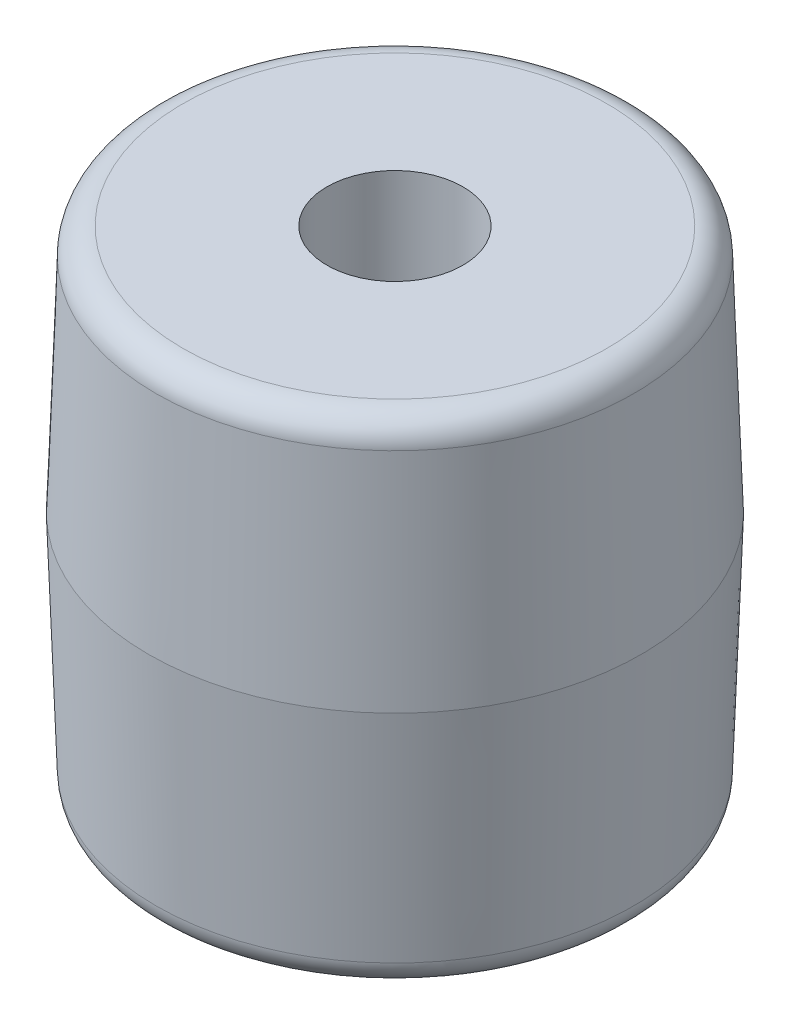
ISO-10303-21;
HEADER;
FILE_DESCRIPTION(('STEP AP214'),'2;1');
FILE_NAME('part.step','',(''),(''),'','','');
FILE_SCHEMA(('AUTOMOTIVE_DESIGN { 1 0 10303 214 1 1 1 1 }'));
ENDSEC;
DATA;
#1=APPLICATION_CONTEXT('core data for automotive mechanical design processes');
#2=APPLICATION_PROTOCOL_DEFINITION('international standard','automotive_design',2000,#1);
#3=PRODUCT_CONTEXT('',#1,'mechanical');
#4=PRODUCT('Part','Part','',(#3));
#5=PRODUCT_RELATED_PRODUCT_CATEGORY('part','',(#4));
#6=PRODUCT_DEFINITION_FORMATION('','',#4);
#7=PRODUCT_DEFINITION_CONTEXT('part definition',#1,'design');
#8=PRODUCT_DEFINITION('design','',#6,#7);
#9=PRODUCT_DEFINITION_SHAPE('','',#8);
#10=(LENGTH_UNIT() NAMED_UNIT(*) SI_UNIT(.MILLI.,.METRE.));
#11=(NAMED_UNIT(*) PLANE_ANGLE_UNIT() SI_UNIT($,.RADIAN.));
#12=(NAMED_UNIT(*) SI_UNIT($,.STERADIAN.) SOLID_ANGLE_UNIT());
#13=UNCERTAINTY_MEASURE_WITH_UNIT(LENGTH_MEASURE(1.E-05),#10,'distance_accuracy_value','');
#14=(GEOMETRIC_REPRESENTATION_CONTEXT(3) GLOBAL_UNCERTAINTY_ASSIGNED_CONTEXT((#13)) GLOBAL_UNIT_ASSIGNED_CONTEXT((#10,
#11,#12)) REPRESENTATION_CONTEXT('',''));
#15=CARTESIAN_POINT('',(0.,0.,0.));
#16=DIRECTION('',(0.,0.,1.));
#17=DIRECTION('',(1.,0.,0.));
#18=AXIS2_PLACEMENT_3D('',#15,#16,#17);
#19=CARTESIAN_POINT('',(0.,0.,0.));
#20=DIRECTION('',(0.,-1.,0.));
#21=DIRECTION('',(0.,0.,1.));
#22=AXIS2_PLACEMENT_3D('',#19,#20,#21);
#23=CONICAL_SURFACE('',#22,9.2075,0.0349065850398867);
#24=CARTESIAN_POINT('',(0.,8.2848994967025,0.));
#25=DIRECTION('',(0.,-1.,0.));
#26=DIRECTION('',(0.,0.,-1.));
#27=AXIS2_PLACEMENT_3D('',#24,#25,#26);
#28=CIRCLE('',#27,8.91818493441336);
#29=CARTESIAN_POINT('',(0.,8.2848994967025,-8.91818493441336));
#30=VERTEX_POINT('',#29);
#31=EDGE_CURVE('E10',#30,#30,#28,.T.);
#32=ORIENTED_EDGE('',*,*,#31,.T.);
#33=EDGE_LOOP('',(#32));
#34=FACE_BOUND('',#33,.T.);
#35=CARTESIAN_POINT('',(0.,0.,0.));
#36=DIRECTION('',(0.,1.,0.));
#37=DIRECTION('',(0.,0.,1.));
#38=AXIS2_PLACEMENT_3D('',#35,#36,#37);
#39=CIRCLE('',#38,9.2075);
#40=CARTESIAN_POINT('',(0.,0.,9.2075));
#41=VERTEX_POINT('',#40);
#42=EDGE_CURVE('E53',#41,#41,#39,.T.);
#43=ORIENTED_EDGE('',*,*,#42,.T.);
#44=EDGE_LOOP('',(#43));
#45=FACE_BOUND('',#44,.T.);
#46=ADVANCED_FACE('F33',(#34,#45),#23,.T.);
#47=CARTESIAN_POINT('',(0.,9.25,0.));
#48=DIRECTION('',(0.,1.,0.));
#49=DIRECTION('',(0.,0.,1.));
#50=AXIS2_PLACEMENT_3D('',#47,#48,#49);
#51=PLANE('',#50);
#52=CARTESIAN_POINT('',(0.,9.25,0.));
#53=DIRECTION('',(0.,1.,0.));
#54=DIRECTION('',(0.,0.,1.));
#55=AXIS2_PLACEMENT_3D('',#52,#53,#54);
#56=CIRCLE('',#55,7.91879410739426);
#57=CARTESIAN_POINT('',(0.,9.25,7.91879410739426));
#58=VERTEX_POINT('',#57);
#59=EDGE_CURVE('E40',#58,#58,#56,.T.);
#60=ORIENTED_EDGE('',*,*,#59,.T.);
#61=EDGE_LOOP('',(#60));
#62=FACE_BOUND('',#61,.T.);
#63=CARTESIAN_POINT('',(0.,9.25,0.));
#64=DIRECTION('',(0.,-1.,0.));
#65=DIRECTION('',(0.,0.,-1.));
#66=AXIS2_PLACEMENT_3D('',#63,#64,#65);
#67=CIRCLE('',#66,2.54);
#68=CARTESIAN_POINT('',(0.,9.25,-2.54));
#69=VERTEX_POINT('',#68);
#70=EDGE_CURVE('E56',#69,#69,#67,.T.);
#71=ORIENTED_EDGE('',*,*,#70,.T.);
#72=EDGE_LOOP('',(#71));
#73=FACE_BOUND('',#72,.T.);
#74=ADVANCED_FACE('F63',(#62,#73),#51,.T.);
#75=CARTESIAN_POINT('',(0.,0.,0.));
#76=DIRECTION('',(0.,1.,0.));
#77=DIRECTION('',(0.,0.,1.));
#78=AXIS2_PLACEMENT_3D('',#75,#76,#77);
#79=CONICAL_SURFACE('',#78,9.2075,0.0349065850398867);
#80=CARTESIAN_POINT('',(0.,-8.28489949670247,0.));
#81=DIRECTION('',(0.,-1.,0.));
#82=DIRECTION('',(0.,0.,-1.));
#83=AXIS2_PLACEMENT_3D('',#80,#81,#82);
#84=CIRCLE('',#83,8.91818493441336);
#85=CARTESIAN_POINT('',(0.,-8.28489949670247,-8.91818493441336));
#86=VERTEX_POINT('',#85);
#87=EDGE_CURVE('E48',#86,#86,#84,.F.);
#88=ORIENTED_EDGE('',*,*,#87,.T.);
#89=EDGE_LOOP('',(#88));
#90=FACE_BOUND('',#89,.T.);
#91=ORIENTED_EDGE('',*,*,#42,.F.);
#92=EDGE_LOOP('',(#91));
#93=FACE_BOUND('',#92,.T.);
#94=ADVANCED_FACE('F74',(#90,#93),#79,.T.);
#95=CARTESIAN_POINT('',(0.,-9.25,0.));
#96=DIRECTION('',(0.,-1.,0.));
#97=DIRECTION('',(0.,0.,1.));
#98=AXIS2_PLACEMENT_3D('',#95,#96,#97);
#99=PLANE('',#98);
#100=CARTESIAN_POINT('',(0.,-9.25,0.));
#101=DIRECTION('',(0.,-1.,0.));
#102=DIRECTION('',(0.,0.,-1.));
#103=AXIS2_PLACEMENT_3D('',#100,#101,#102);
#104=CIRCLE('',#103,7.91879410739426);
#105=CARTESIAN_POINT('',(0.,-9.25,-7.91879410739426));
#106=VERTEX_POINT('',#105);
#107=EDGE_CURVE('E44',#106,#106,#104,.T.);
#108=ORIENTED_EDGE('',*,*,#107,.T.);
#109=EDGE_LOOP('',(#108));
#110=FACE_BOUND('',#109,.T.);
#111=CARTESIAN_POINT('',(0.,-9.25,0.));
#112=DIRECTION('',(0.,-1.,0.));
#113=DIRECTION('',(0.,0.,-1.));
#114=AXIS2_PLACEMENT_3D('',#111,#112,#113);
#115=CIRCLE('',#114,2.54);
#116=CARTESIAN_POINT('',(0.,-9.25,-2.54));
#117=VERTEX_POINT('',#116);
#118=EDGE_CURVE('E57',#117,#117,#115,.T.);
#119=ORIENTED_EDGE('',*,*,#118,.F.);
#120=EDGE_LOOP('',(#119));
#121=FACE_BOUND('',#120,.T.);
#122=ADVANCED_FACE('F69',(#110,#121),#99,.T.);
#123=CARTESIAN_POINT('',(0.,9.25,0.));
#124=DIRECTION('',(0.,-1.,0.));
#125=DIRECTION('',(0.,0.,-1.));
#126=AXIS2_PLACEMENT_3D('',#123,#124,#125);
#127=CYLINDRICAL_SURFACE('',#126,2.54);
#128=ORIENTED_EDGE('',*,*,#70,.F.);
#129=EDGE_LOOP('',(#128));
#130=FACE_BOUND('',#129,.T.);
#131=ORIENTED_EDGE('',*,*,#118,.T.);
#132=EDGE_LOOP('',(#131));
#133=FACE_BOUND('',#132,.T.);
#134=ADVANCED_FACE('F65',(#130,#133),#127,.F.);
#135=CARTESIAN_POINT('',(0.,-8.25,0.));
#136=DIRECTION('',(0.,-1.,0.));
#137=DIRECTION('',(0.,0.,-1.));
#138=AXIS2_PLACEMENT_3D('',#135,#136,#137);
#139=TOROIDAL_SURFACE('',#138,7.91879410739426,1.);
#140=ORIENTED_EDGE('',*,*,#107,.F.);
#141=EDGE_LOOP('',(#140));
#142=FACE_BOUND('',#141,.T.);
#143=ORIENTED_EDGE('',*,*,#87,.F.);
#144=EDGE_LOOP('',(#143));
#145=FACE_BOUND('',#144,.T.);
#146=ADVANCED_FACE('F68',(#142,#145),#139,.T.);
#147=CARTESIAN_POINT('',(0.,8.25,0.));
#148=DIRECTION('',(0.,1.,0.));
#149=DIRECTION('',(0.,0.,1.));
#150=AXIS2_PLACEMENT_3D('',#147,#148,#149);
#151=TOROIDAL_SURFACE('',#150,7.91879410739426,1.);
#152=ORIENTED_EDGE('',*,*,#31,.F.);
#153=EDGE_LOOP('',(#152));
#154=FACE_BOUND('',#153,.T.);
#155=ORIENTED_EDGE('',*,*,#59,.F.);
#156=EDGE_LOOP('',(#155));
#157=FACE_BOUND('',#156,.T.);
#158=ADVANCED_FACE('F35',(#154,#157),#151,.T.);
#159=CLOSED_SHELL('',(#46,#74,#94,#122,#134,#146,#158));
#160=MANIFOLD_SOLID_BREP('B2',#159);
#161=ADVANCED_BREP_SHAPE_REPRESENTATION('',(#18,#160),#14);
#162=SHAPE_DEFINITION_REPRESENTATION(#9,#161);
ENDSEC;
END-ISO-10303-21;
